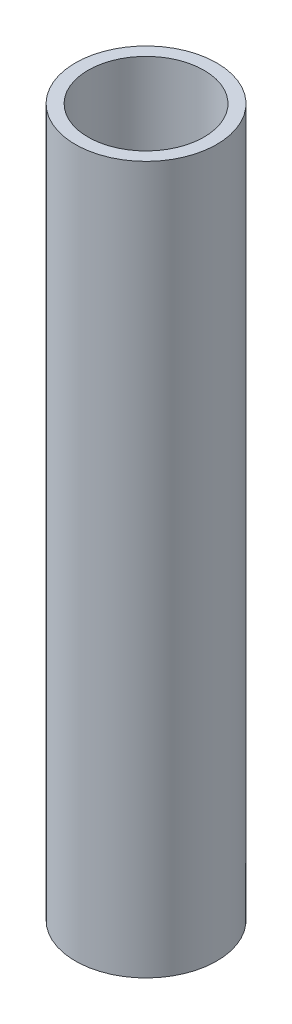
ISO-10303-21;
HEADER;
FILE_DESCRIPTION(('STEP AP214'),'2;1');
FILE_NAME('part.step','',(''),(''),'','','');
FILE_SCHEMA(('AUTOMOTIVE_DESIGN { 1 0 10303 214 1 1 1 1 }'));
ENDSEC;
DATA;
#1=APPLICATION_CONTEXT('core data for automotive mechanical design processes');
#2=APPLICATION_PROTOCOL_DEFINITION('international standard','automotive_design',2000,#1);
#3=PRODUCT_CONTEXT('',#1,'mechanical');
#4=PRODUCT('Part','Part','',(#3));
#5=PRODUCT_RELATED_PRODUCT_CATEGORY('part','',(#4));
#6=PRODUCT_DEFINITION_FORMATION('','',#4);
#7=PRODUCT_DEFINITION_CONTEXT('part definition',#1,'design');
#8=PRODUCT_DEFINITION('design','',#6,#7);
#9=PRODUCT_DEFINITION_SHAPE('','',#8);
#10=(LENGTH_UNIT() NAMED_UNIT(*) SI_UNIT(.MILLI.,.METRE.));
#11=(NAMED_UNIT(*) PLANE_ANGLE_UNIT() SI_UNIT($,.RADIAN.));
#12=(NAMED_UNIT(*) SI_UNIT($,.STERADIAN.) SOLID_ANGLE_UNIT());
#13=UNCERTAINTY_MEASURE_WITH_UNIT(LENGTH_MEASURE(1.E-05),#10,'distance_accuracy_value','');
#14=(GEOMETRIC_REPRESENTATION_CONTEXT(3) GLOBAL_UNCERTAINTY_ASSIGNED_CONTEXT((#13)) GLOBAL_UNIT_ASSIGNED_CONTEXT((#10,
#11,#12)) REPRESENTATION_CONTEXT('',''));
#15=CARTESIAN_POINT('',(0.,0.,0.));
#16=DIRECTION('',(0.,0.,1.));
#17=DIRECTION('',(1.,0.,0.));
#18=AXIS2_PLACEMENT_3D('',#15,#16,#17);
#19=CARTESIAN_POINT('',(0.,127.,0.));
#20=DIRECTION('',(0.,-1.,0.));
#21=DIRECTION('',(0.,0.,-1.));
#22=AXIS2_PLACEMENT_3D('',#19,#20,#21);
#23=CYLINDRICAL_SURFACE('',#22,12.69619);
#24=CARTESIAN_POINT('',(0.,127.,0.));
#25=DIRECTION('',(0.,-1.,0.));
#26=DIRECTION('',(0.,0.,-1.));
#27=AXIS2_PLACEMENT_3D('',#24,#25,#26);
#28=CIRCLE('',#27,12.69619);
#29=CARTESIAN_POINT('',(0.,127.,-12.69619));
#30=VERTEX_POINT('',#29);
#31=EDGE_CURVE('E10',#30,#30,#28,.T.);
#32=ORIENTED_EDGE('',*,*,#31,.T.);
#33=EDGE_LOOP('',(#32));
#34=FACE_BOUND('',#33,.T.);
#35=CARTESIAN_POINT('',(0.,0.,0.));
#36=DIRECTION('',(0.,-1.,0.));
#37=DIRECTION('',(0.,0.,-1.));
#38=AXIS2_PLACEMENT_3D('',#35,#36,#37);
#39=CIRCLE('',#38,12.69619);
#40=CARTESIAN_POINT('',(0.,0.,-12.69619));
#41=VERTEX_POINT('',#40);
#42=EDGE_CURVE('E45',#41,#41,#39,.T.);
#43=ORIENTED_EDGE('',*,*,#42,.F.);
#44=EDGE_LOOP('',(#43));
#45=FACE_BOUND('',#44,.T.);
#46=ADVANCED_FACE('F31',(#34,#45),#23,.T.);
#47=CARTESIAN_POINT('',(12.69619,127.,0.));
#48=DIRECTION('',(0.,1.,0.));
#49=DIRECTION('',(0.,0.,1.));
#50=AXIS2_PLACEMENT_3D('',#47,#48,#49);
#51=PLANE('',#50);
#52=CARTESIAN_POINT('',(0.,127.,0.));
#53=DIRECTION('',(0.,-1.,0.));
#54=DIRECTION('',(0.,0.,-1.));
#55=AXIS2_PLACEMENT_3D('',#52,#53,#54);
#56=CIRCLE('',#55,10.41019);
#57=CARTESIAN_POINT('',(0.,127.,-10.41019));
#58=VERTEX_POINT('',#57);
#59=EDGE_CURVE('E37',#58,#58,#56,.T.);
#60=ORIENTED_EDGE('',*,*,#59,.T.);
#61=EDGE_LOOP('',(#60));
#62=FACE_BOUND('',#61,.T.);
#63=ORIENTED_EDGE('',*,*,#31,.F.);
#64=EDGE_LOOP('',(#63));
#65=FACE_BOUND('',#64,.T.);
#66=ADVANCED_FACE('F55',(#62,#65),#51,.T.);
#67=CARTESIAN_POINT('',(0.,127.,0.));
#68=DIRECTION('',(0.,-1.,0.));
#69=DIRECTION('',(0.,0.,-1.));
#70=AXIS2_PLACEMENT_3D('',#67,#68,#69);
#71=CYLINDRICAL_SURFACE('',#70,10.41019);
#72=CARTESIAN_POINT('',(0.,0.,0.));
#73=DIRECTION('',(0.,-1.,0.));
#74=DIRECTION('',(0.,0.,-1.));
#75=AXIS2_PLACEMENT_3D('',#72,#73,#74);
#76=CIRCLE('',#75,10.41019);
#77=CARTESIAN_POINT('',(0.,0.,-10.41019));
#78=VERTEX_POINT('',#77);
#79=EDGE_CURVE('E41',#78,#78,#76,.T.);
#80=ORIENTED_EDGE('',*,*,#79,.T.);
#81=EDGE_LOOP('',(#80));
#82=FACE_BOUND('',#81,.T.);
#83=ORIENTED_EDGE('',*,*,#59,.F.);
#84=EDGE_LOOP('',(#83));
#85=FACE_BOUND('',#84,.T.);
#86=ADVANCED_FACE('F59',(#82,#85),#71,.F.);
#87=CARTESIAN_POINT('',(10.41019,0.,0.));
#88=DIRECTION('',(0.,-1.,0.));
#89=DIRECTION('',(0.,0.,-1.));
#90=AXIS2_PLACEMENT_3D('',#87,#88,#89);
#91=PLANE('',#90);
#92=ORIENTED_EDGE('',*,*,#42,.T.);
#93=EDGE_LOOP('',(#92));
#94=FACE_BOUND('',#93,.T.);
#95=ORIENTED_EDGE('',*,*,#79,.F.);
#96=EDGE_LOOP('',(#95));
#97=FACE_BOUND('',#96,.T.);
#98=ADVANCED_FACE('F51',(#94,#97),#91,.T.);
#99=CLOSED_SHELL('',(#46,#66,#86,#98));
#100=MANIFOLD_SOLID_BREP('B2',#99);
#101=ADVANCED_BREP_SHAPE_REPRESENTATION('',(#18,#100),#14);
#102=SHAPE_DEFINITION_REPRESENTATION(#9,#101);
ENDSEC;
END-ISO-10303-21;
